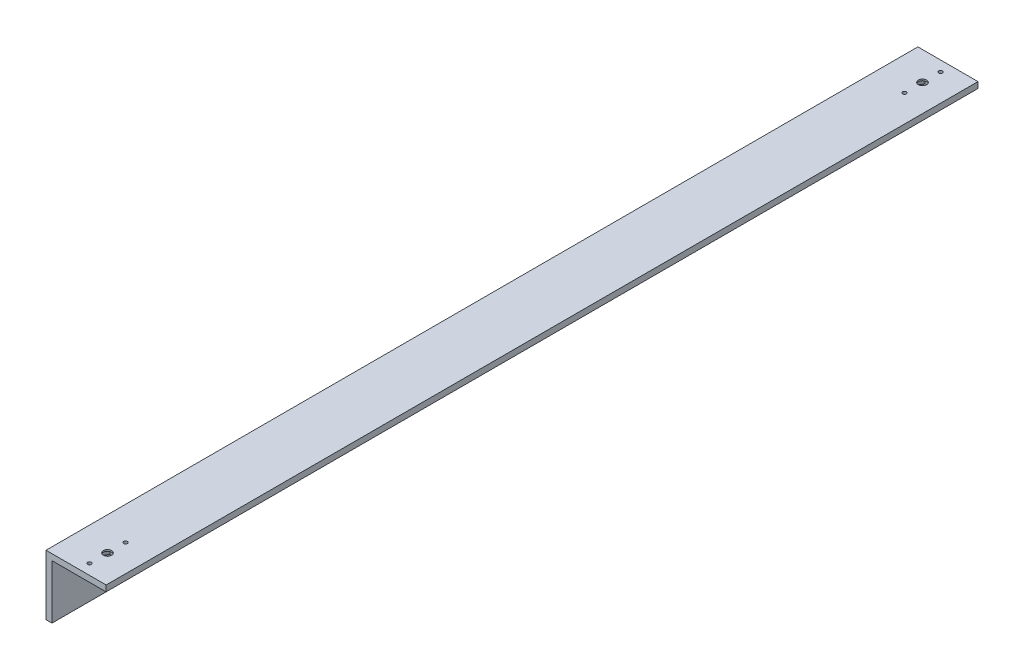
ISO-10303-21;
HEADER;
FILE_DESCRIPTION(('STEP AP214'),'2;1');
FILE_NAME('part.step','',(''),(''),'','','');
FILE_SCHEMA(('AUTOMOTIVE_DESIGN { 1 0 10303 214 1 1 1 1 }'));
ENDSEC;
DATA;
#1=APPLICATION_CONTEXT('core data for automotive mechanical design processes');
#2=APPLICATION_PROTOCOL_DEFINITION('international standard','automotive_design',2000,#1);
#3=PRODUCT_CONTEXT('',#1,'mechanical');
#4=PRODUCT('Part','Part','',(#3));
#5=PRODUCT_RELATED_PRODUCT_CATEGORY('part','',(#4));
#6=PRODUCT_DEFINITION_FORMATION('','',#4);
#7=PRODUCT_DEFINITION_CONTEXT('part definition',#1,'design');
#8=PRODUCT_DEFINITION('design','',#6,#7);
#9=PRODUCT_DEFINITION_SHAPE('','',#8);
#10=(LENGTH_UNIT() NAMED_UNIT(*) SI_UNIT(.MILLI.,.METRE.));
#11=(NAMED_UNIT(*) PLANE_ANGLE_UNIT() SI_UNIT($,.RADIAN.));
#12=(NAMED_UNIT(*) SI_UNIT($,.STERADIAN.) SOLID_ANGLE_UNIT());
#13=UNCERTAINTY_MEASURE_WITH_UNIT(LENGTH_MEASURE(1.E-05),#10,'distance_accuracy_value','');
#14=(GEOMETRIC_REPRESENTATION_CONTEXT(3) GLOBAL_UNCERTAINTY_ASSIGNED_CONTEXT((#13)) GLOBAL_UNIT_ASSIGNED_CONTEXT((#10,
#11,#12)) REPRESENTATION_CONTEXT('',''));
#15=CARTESIAN_POINT('',(0.,0.,0.));
#16=DIRECTION('',(0.,0.,1.));
#17=DIRECTION('',(1.,0.,0.));
#18=AXIS2_PLACEMENT_3D('',#15,#16,#17);
#19=CARTESIAN_POINT('',(40.,36.,580.));
#20=DIRECTION('',(0.,1.,0.));
#21=DIRECTION('',(-1.,0.,0.));
#22=AXIS2_PLACEMENT_3D('',#19,#20,#21);
#23=PLANE('',#22);
#24=CARTESIAN_POINT('',(21.9999999999999,36.,549.075735931289));
#25=DIRECTION('',(0.,1.,0.));
#26=DIRECTION('',(-1.,0.,0.));
#27=AXIS2_PLACEMENT_3D('',#24,#25,#26);
#28=CIRCLE('',#27,1.24999999999999);
#29=CARTESIAN_POINT('',(20.7499999999999,36.,549.075735931289));
#30=VERTEX_POINT('',#29);
#31=EDGE_CURVE('E348',#30,#30,#28,.T.);
#32=ORIENTED_EDGE('',*,*,#31,.T.);
#33=EDGE_LOOP('',(#32));
#34=FACE_BOUND('',#33,.T.);
#35=CARTESIAN_POINT('',(21.9999999999999,36.,573.075735931289));
#36=DIRECTION('',(0.,1.,0.));
#37=DIRECTION('',(-1.,0.,0.));
#38=AXIS2_PLACEMENT_3D('',#35,#36,#37);
#39=CIRCLE('',#38,1.24999999999999);
#40=CARTESIAN_POINT('',(20.7499999999999,36.,573.075735931289));
#41=VERTEX_POINT('',#40);
#42=EDGE_CURVE('E347',#41,#41,#39,.T.);
#43=ORIENTED_EDGE('',*,*,#42,.T.);
#44=EDGE_LOOP('',(#43));
#45=FACE_BOUND('',#44,.T.);
#46=CARTESIAN_POINT('',(21.9999999999999,36.,30.9242640687114));
#47=DIRECTION('',(0.,1.,0.));
#48=DIRECTION('',(-1.,0.,0.));
#49=AXIS2_PLACEMENT_3D('',#46,#47,#48);
#50=CIRCLE('',#49,1.24999999999999);
#51=CARTESIAN_POINT('',(20.7499999999999,36.,30.9242640687114));
#52=VERTEX_POINT('',#51);
#53=EDGE_CURVE('E374',#52,#52,#50,.T.);
#54=ORIENTED_EDGE('',*,*,#53,.T.);
#55=EDGE_LOOP('',(#54));
#56=FACE_BOUND('',#55,.T.);
#57=CARTESIAN_POINT('',(21.9999999999999,36.,6.9242640687114));
#58=DIRECTION('',(0.,1.,0.));
#59=DIRECTION('',(-1.,0.,0.));
#60=AXIS2_PLACEMENT_3D('',#57,#58,#59);
#61=CIRCLE('',#60,1.24999999999999);
#62=CARTESIAN_POINT('',(20.7499999999999,36.,6.9242640687114));
#63=VERTEX_POINT('',#62);
#64=EDGE_CURVE('E49',#63,#63,#61,.T.);
#65=ORIENTED_EDGE('',*,*,#64,.T.);
#66=EDGE_LOOP('',(#65));
#67=FACE_BOUND('',#66,.T.);
#68=DIRECTION('',(-0.5,0.,-0.866025403784439));
#69=VECTOR('',#68,1.);
#70=CARTESIAN_POINT('',(26.6188021535169,36.,561.075735931289));
#71=LINE('',#70,#69);
#72=CARTESIAN_POINT('',(26.6188021535169,36.,561.075735931289));
#73=VERTEX_POINT('',#72);
#74=CARTESIAN_POINT('',(24.3094010767584,36.,557.075735931289));
#75=VERTEX_POINT('',#74);
#76=EDGE_CURVE('E69',#73,#75,#71,.T.);
#77=ORIENTED_EDGE('',*,*,#76,.T.);
#78=DIRECTION('',(-1.,0.,0.));
#79=VECTOR('',#78,1.);
#80=CARTESIAN_POINT('',(24.3094010767584,36.,557.075735931289));
#81=LINE('',#80,#79);
#82=CARTESIAN_POINT('',(19.6905989232415,36.,557.075735931289));
#83=VERTEX_POINT('',#82);
#84=EDGE_CURVE('E426',#75,#83,#81,.T.);
#85=ORIENTED_EDGE('',*,*,#84,.T.);
#86=DIRECTION('',(-0.5,0.,0.866025403784439));
#87=VECTOR('',#86,1.);
#88=CARTESIAN_POINT('',(19.6905989232415,36.,557.075735931289));
#89=LINE('',#88,#87);
#90=CARTESIAN_POINT('',(17.3811978464829,36.,561.075735931289));
#91=VERTEX_POINT('',#90);
#92=EDGE_CURVE('E429',#83,#91,#89,.T.);
#93=ORIENTED_EDGE('',*,*,#92,.T.);
#94=DIRECTION('',(0.500000000000004,0.,0.866025403784436));
#95=VECTOR('',#94,1.);
#96=CARTESIAN_POINT('',(17.3811978464829,36.,561.075735931289));
#97=LINE('',#96,#95);
#98=CARTESIAN_POINT('',(19.6905989232415,36.,565.075735931289));
#99=VERTEX_POINT('',#98);
#100=EDGE_CURVE('E432',#91,#99,#97,.T.);
#101=ORIENTED_EDGE('',*,*,#100,.T.);
#102=DIRECTION('',(1.,0.,0.));
#103=VECTOR('',#102,1.);
#104=CARTESIAN_POINT('',(19.6905989232415,36.,565.075735931289));
#105=LINE('',#104,#103);
#106=CARTESIAN_POINT('',(24.3094010767584,36.,565.075735931289));
#107=VERTEX_POINT('',#106);
#108=EDGE_CURVE('E435',#99,#107,#105,.T.);
#109=ORIENTED_EDGE('',*,*,#108,.T.);
#110=DIRECTION('',(0.499999999999996,0.,-0.866025403784441));
#111=VECTOR('',#110,1.);
#112=CARTESIAN_POINT('',(24.3094010767584,36.,565.075735931289));
#113=LINE('',#112,#111);
#114=EDGE_CURVE('E438',#107,#73,#113,.T.);
#115=ORIENTED_EDGE('',*,*,#114,.T.);
#116=EDGE_LOOP('',(#77,#85,#93,#101,#109,#115));
#117=FACE_BOUND('',#116,.T.);
#118=DIRECTION('',(1.,0.,0.));
#119=VECTOR('',#118,1.);
#120=CARTESIAN_POINT('',(40.,36.,0.));
#121=LINE('',#120,#119);
#122=CARTESIAN_POINT('',(4.,36.,0.));
#123=VERTEX_POINT('',#122);
#124=CARTESIAN_POINT('',(40.,36.,0.));
#125=VERTEX_POINT('',#124);
#126=EDGE_CURVE('E311',#123,#125,#121,.T.);
#127=ORIENTED_EDGE('',*,*,#126,.T.);
#128=DIRECTION('',(0.,0.,-1.));
#129=VECTOR('',#128,1.);
#130=CARTESIAN_POINT('',(40.,36.,580.));
#131=LINE('',#130,#129);
#132=CARTESIAN_POINT('',(40.,36.,580.));
#133=VERTEX_POINT('',#132);
#134=EDGE_CURVE('E317',#133,#125,#131,.T.);
#135=ORIENTED_EDGE('',*,*,#134,.F.);
#136=DIRECTION('',(1.,0.,0.));
#137=VECTOR('',#136,1.);
#138=CARTESIAN_POINT('',(40.,36.,580.));
#139=LINE('',#138,#137);
#140=CARTESIAN_POINT('',(4.,36.,580.));
#141=VERTEX_POINT('',#140);
#142=EDGE_CURVE('E316',#141,#133,#139,.T.);
#143=ORIENTED_EDGE('',*,*,#142,.F.);
#144=DIRECTION('',(0.,0.,-1.));
#145=VECTOR('',#144,1.);
#146=CARTESIAN_POINT('',(4.,36.,580.));
#147=LINE('',#146,#145);
#148=EDGE_CURVE('E54',#141,#123,#147,.T.);
#149=ORIENTED_EDGE('',*,*,#148,.T.);
#150=EDGE_LOOP('',(#127,#135,#143,#149));
#151=FACE_BOUND('',#150,.T.);
#152=DIRECTION('',(-0.500000000000001,0.,-0.866025403784438));
#153=VECTOR('',#152,1.);
#154=CARTESIAN_POINT('',(26.6188021535169,36.,18.9242640687114));
#155=LINE('',#154,#153);
#156=CARTESIAN_POINT('',(26.6188021535169,36.,18.9242640687114));
#157=VERTEX_POINT('',#156);
#158=CARTESIAN_POINT('',(24.3094010767584,36.,14.9242640687114));
#159=VERTEX_POINT('',#158);
#160=EDGE_CURVE('E61',#157,#159,#155,.T.);
#161=ORIENTED_EDGE('',*,*,#160,.T.);
#162=DIRECTION('',(-1.,0.,0.));
#163=VECTOR('',#162,1.);
#164=CARTESIAN_POINT('',(24.3094010767584,36.,14.9242640687114));
#165=LINE('',#164,#163);
#166=CARTESIAN_POINT('',(19.6905989232414,36.,14.9242640687114));
#167=VERTEX_POINT('',#166);
#168=EDGE_CURVE('E194',#159,#167,#165,.T.);
#169=ORIENTED_EDGE('',*,*,#168,.T.);
#170=DIRECTION('',(-0.5,0.,0.866025403784439));
#171=VECTOR('',#170,1.);
#172=CARTESIAN_POINT('',(19.6905989232414,36.,14.9242640687114));
#173=LINE('',#172,#171);
#174=CARTESIAN_POINT('',(17.3811978464829,36.,18.9242640687114));
#175=VERTEX_POINT('',#174);
#176=EDGE_CURVE('E228',#167,#175,#173,.T.);
#177=ORIENTED_EDGE('',*,*,#176,.T.);
#178=DIRECTION('',(0.5,0.,0.866025403784438));
#179=VECTOR('',#178,1.);
#180=CARTESIAN_POINT('',(17.3811978464829,36.,18.9242640687114));
#181=LINE('',#180,#179);
#182=CARTESIAN_POINT('',(19.6905989232414,36.,22.9242640687114));
#183=VERTEX_POINT('',#182);
#184=EDGE_CURVE('E231',#175,#183,#181,.T.);
#185=ORIENTED_EDGE('',*,*,#184,.T.);
#186=DIRECTION('',(1.,0.,0.));
#187=VECTOR('',#186,1.);
#188=CARTESIAN_POINT('',(19.6905989232414,36.,22.9242640687114));
#189=LINE('',#188,#187);
#190=CARTESIAN_POINT('',(24.3094010767584,36.,22.9242640687114));
#191=VERTEX_POINT('',#190);
#192=EDGE_CURVE('E234',#183,#191,#189,.T.);
#193=ORIENTED_EDGE('',*,*,#192,.T.);
#194=DIRECTION('',(0.5,0.,-0.866025403784438));
#195=VECTOR('',#194,1.);
#196=CARTESIAN_POINT('',(24.3094010767584,36.,22.9242640687114));
#197=LINE('',#196,#195);
#198=EDGE_CURVE('E190',#191,#157,#197,.T.);
#199=ORIENTED_EDGE('',*,*,#198,.T.);
#200=EDGE_LOOP('',(#161,#169,#177,#185,#193,#199));
#201=FACE_BOUND('',#200,.T.);
#202=ADVANCED_FACE('F45',(#34,#45,#56,#67,#117,#151,#201),#23,.F.);
#203=CARTESIAN_POINT('',(4.,0.,580.));
#204=DIRECTION('',(0.,1.,0.));
#205=DIRECTION('',(-1.,0.,0.));
#206=AXIS2_PLACEMENT_3D('',#203,#204,#205);
#207=PLANE('',#206);
#208=DIRECTION('',(1.,0.,0.));
#209=VECTOR('',#208,1.);
#210=CARTESIAN_POINT('',(4.,0.,0.));
#211=LINE('',#210,#209);
#212=CARTESIAN_POINT('',(0.,0.,0.));
#213=VERTEX_POINT('',#212);
#214=CARTESIAN_POINT('',(4.,0.,0.));
#215=VERTEX_POINT('',#214);
#216=EDGE_CURVE('E195',#213,#215,#211,.T.);
#217=ORIENTED_EDGE('',*,*,#216,.T.);
#218=DIRECTION('',(0.,0.,-1.));
#219=VECTOR('',#218,1.);
#220=CARTESIAN_POINT('',(4.,0.,580.));
#221=LINE('',#220,#219);
#222=CARTESIAN_POINT('',(4.,0.,580.));
#223=VERTEX_POINT('',#222);
#224=EDGE_CURVE('E12',#223,#215,#221,.T.);
#225=ORIENTED_EDGE('',*,*,#224,.F.);
#226=DIRECTION('',(1.,0.,0.));
#227=VECTOR('',#226,1.);
#228=CARTESIAN_POINT('',(4.,0.,580.));
#229=LINE('',#228,#227);
#230=CARTESIAN_POINT('',(0.,0.,580.));
#231=VERTEX_POINT('',#230);
#232=EDGE_CURVE('E528',#231,#223,#229,.T.);
#233=ORIENTED_EDGE('',*,*,#232,.F.);
#234=DIRECTION('',(0.,0.,-1.));
#235=VECTOR('',#234,1.);
#236=CARTESIAN_POINT('',(0.,0.,580.));
#237=LINE('',#236,#235);
#238=EDGE_CURVE('E526',#231,#213,#237,.T.);
#239=ORIENTED_EDGE('',*,*,#238,.T.);
#240=EDGE_LOOP('',(#217,#225,#233,#239));
#241=FACE_BOUND('',#240,.T.);
#242=ADVANCED_FACE('F47',(#241),#207,.F.);
#243=CARTESIAN_POINT('',(4.,36.,580.));
#244=DIRECTION('',(-1.,0.,0.));
#245=DIRECTION('',(0.,-1.,0.));
#246=AXIS2_PLACEMENT_3D('',#243,#244,#245);
#247=PLANE('',#246);
#248=DIRECTION('',(0.,1.,0.));
#249=VECTOR('',#248,1.);
#250=CARTESIAN_POINT('',(4.,36.,0.));
#251=LINE('',#250,#249);
#252=EDGE_CURVE('E199',#215,#123,#251,.T.);
#253=ORIENTED_EDGE('',*,*,#252,.T.);
#254=ORIENTED_EDGE('',*,*,#148,.F.);
#255=DIRECTION('',(0.,1.,0.));
#256=VECTOR('',#255,1.);
#257=CARTESIAN_POINT('',(4.,36.,580.));
#258=LINE('',#257,#256);
#259=EDGE_CURVE('E530',#223,#141,#258,.T.);
#260=ORIENTED_EDGE('',*,*,#259,.F.);
#261=ORIENTED_EDGE('',*,*,#224,.T.);
#262=EDGE_LOOP('',(#253,#254,#260,#261));
#263=FACE_BOUND('',#262,.T.);
#264=ADVANCED_FACE('F290',(#263),#247,.F.);
#265=CARTESIAN_POINT('',(40.,40.,580.));
#266=DIRECTION('',(-1.,0.,0.));
#267=DIRECTION('',(0.,0.,1.));
#268=AXIS2_PLACEMENT_3D('',#265,#266,#267);
#269=PLANE('',#268);
#270=DIRECTION('',(0.,1.,0.));
#271=VECTOR('',#270,1.);
#272=CARTESIAN_POINT('',(40.,40.,0.));
#273=LINE('',#272,#271);
#274=CARTESIAN_POINT('',(40.,40.,0.));
#275=VERTEX_POINT('',#274);
#276=EDGE_CURVE('E322',#125,#275,#273,.T.);
#277=ORIENTED_EDGE('',*,*,#276,.T.);
#278=DIRECTION('',(0.,0.,-1.));
#279=VECTOR('',#278,1.);
#280=CARTESIAN_POINT('',(40.,40.,580.));
#281=LINE('',#280,#279);
#282=CARTESIAN_POINT('',(40.,40.,580.));
#283=VERTEX_POINT('',#282);
#284=EDGE_CURVE('E519',#283,#275,#281,.T.);
#285=ORIENTED_EDGE('',*,*,#284,.F.);
#286=DIRECTION('',(0.,1.,0.));
#287=VECTOR('',#286,1.);
#288=CARTESIAN_POINT('',(40.,40.,580.));
#289=LINE('',#288,#287);
#290=EDGE_CURVE('E535',#133,#283,#289,.T.);
#291=ORIENTED_EDGE('',*,*,#290,.F.);
#292=ORIENTED_EDGE('',*,*,#134,.T.);
#293=EDGE_LOOP('',(#277,#285,#291,#292));
#294=FACE_BOUND('',#293,.T.);
#295=ADVANCED_FACE('F295',(#294),#269,.F.);
#296=CARTESIAN_POINT('',(0.,40.,580.));
#297=DIRECTION('',(0.,-1.,0.));
#298=DIRECTION('',(0.,0.,-1.));
#299=AXIS2_PLACEMENT_3D('',#296,#297,#298);
#300=PLANE('',#299);
#301=CARTESIAN_POINT('',(22.,40.,561.075735931289));
#302=DIRECTION('',(0.,-1.,0.));
#303=DIRECTION('',(0.,0.,-1.));
#304=AXIS2_PLACEMENT_3D('',#301,#302,#303);
#305=CIRCLE('',#304,2.75);
#306=CARTESIAN_POINT('',(22.,40.,558.325735931289));
#307=VERTEX_POINT('',#306);
#308=EDGE_CURVE('E500',#307,#307,#305,.T.);
#309=ORIENTED_EDGE('',*,*,#308,.T.);
#310=EDGE_LOOP('',(#309));
#311=FACE_BOUND('',#310,.T.);
#312=CARTESIAN_POINT('',(21.9999999999999,40.,18.9242640687114));
#313=DIRECTION('',(0.,-1.,0.));
#314=DIRECTION('',(0.,0.,-1.));
#315=AXIS2_PLACEMENT_3D('',#312,#313,#314);
#316=CIRCLE('',#315,2.75);
#317=CARTESIAN_POINT('',(21.9999999999999,40.,16.1742640687114));
#318=VERTEX_POINT('',#317);
#319=EDGE_CURVE('E359',#318,#318,#316,.T.);
#320=ORIENTED_EDGE('',*,*,#319,.T.);
#321=EDGE_LOOP('',(#320));
#322=FACE_BOUND('',#321,.T.);
#323=CARTESIAN_POINT('',(21.9999999999999,40.,549.075735931289));
#324=DIRECTION('',(0.,1.,0.));
#325=DIRECTION('',(0.,0.,1.));
#326=AXIS2_PLACEMENT_3D('',#323,#324,#325);
#327=CIRCLE('',#326,1.24999999999999);
#328=CARTESIAN_POINT('',(21.9999999999999,40.,550.325735931288));
#329=VERTEX_POINT('',#328);
#330=EDGE_CURVE('E364',#329,#329,#327,.T.);
#331=ORIENTED_EDGE('',*,*,#330,.F.);
#332=EDGE_LOOP('',(#331));
#333=FACE_BOUND('',#332,.T.);
#334=CARTESIAN_POINT('',(21.9999999999999,40.,573.075735931289));
#335=DIRECTION('',(0.,1.,0.));
#336=DIRECTION('',(0.,0.,1.));
#337=AXIS2_PLACEMENT_3D('',#334,#335,#336);
#338=CIRCLE('',#337,1.24999999999999);
#339=CARTESIAN_POINT('',(21.9999999999999,40.,574.325735931289));
#340=VERTEX_POINT('',#339);
#341=EDGE_CURVE('E341',#340,#340,#338,.T.);
#342=ORIENTED_EDGE('',*,*,#341,.F.);
#343=EDGE_LOOP('',(#342));
#344=FACE_BOUND('',#343,.T.);
#345=CARTESIAN_POINT('',(21.9999999999999,40.,30.9242640687114));
#346=DIRECTION('',(0.,1.,0.));
#347=DIRECTION('',(0.,0.,1.));
#348=AXIS2_PLACEMENT_3D('',#345,#346,#347);
#349=CIRCLE('',#348,1.24999999999999);
#350=CARTESIAN_POINT('',(21.9999999999999,40.,32.1742640687114));
#351=VERTEX_POINT('',#350);
#352=EDGE_CURVE('E370',#351,#351,#349,.T.);
#353=ORIENTED_EDGE('',*,*,#352,.F.);
#354=EDGE_LOOP('',(#353));
#355=FACE_BOUND('',#354,.T.);
#356=CARTESIAN_POINT('',(21.9999999999999,40.,6.9242640687114));
#357=DIRECTION('',(0.,1.,0.));
#358=DIRECTION('',(0.,0.,1.));
#359=AXIS2_PLACEMENT_3D('',#356,#357,#358);
#360=CIRCLE('',#359,1.24999999999999);
#361=CARTESIAN_POINT('',(21.9999999999999,40.,8.1742640687114));
#362=VERTEX_POINT('',#361);
#363=EDGE_CURVE('E378',#362,#362,#360,.T.);
#364=ORIENTED_EDGE('',*,*,#363,.F.);
#365=EDGE_LOOP('',(#364));
#366=FACE_BOUND('',#365,.T.);
#367=DIRECTION('',(-1.,0.,0.));
#368=VECTOR('',#367,1.);
#369=CARTESIAN_POINT('',(0.,40.,0.));
#370=LINE('',#369,#368);
#371=CARTESIAN_POINT('',(0.,40.,0.));
#372=VERTEX_POINT('',#371);
#373=EDGE_CURVE('E325',#275,#372,#370,.T.);
#374=ORIENTED_EDGE('',*,*,#373,.T.);
#375=DIRECTION('',(0.,0.,-1.));
#376=VECTOR('',#375,1.);
#377=CARTESIAN_POINT('',(0.,40.,580.));
#378=LINE('',#377,#376);
#379=CARTESIAN_POINT('',(0.,40.,580.));
#380=VERTEX_POINT('',#379);
#381=EDGE_CURVE('E516',#380,#372,#378,.T.);
#382=ORIENTED_EDGE('',*,*,#381,.F.);
#383=DIRECTION('',(-1.,0.,0.));
#384=VECTOR('',#383,1.);
#385=CARTESIAN_POINT('',(0.,40.,580.));
#386=LINE('',#385,#384);
#387=EDGE_CURVE('E536',#283,#380,#386,.T.);
#388=ORIENTED_EDGE('',*,*,#387,.F.);
#389=ORIENTED_EDGE('',*,*,#284,.T.);
#390=EDGE_LOOP('',(#374,#382,#388,#389));
#391=FACE_BOUND('',#390,.T.);
#392=ADVANCED_FACE('F302',(#311,#322,#333,#344,#355,#366,#391),#300,.F.);
#393=CARTESIAN_POINT('',(0.,0.,580.));
#394=DIRECTION('',(1.,0.,0.));
#395=DIRECTION('',(0.,0.,-1.));
#396=AXIS2_PLACEMENT_3D('',#393,#394,#395);
#397=PLANE('',#396);
#398=DIRECTION('',(0.,-1.,0.));
#399=VECTOR('',#398,1.);
#400=CARTESIAN_POINT('',(0.,0.,0.));
#401=LINE('',#400,#399);
#402=EDGE_CURVE('E522',#372,#213,#401,.T.);
#403=ORIENTED_EDGE('',*,*,#402,.T.);
#404=ORIENTED_EDGE('',*,*,#238,.F.);
#405=DIRECTION('',(0.,-1.,0.));
#406=VECTOR('',#405,1.);
#407=CARTESIAN_POINT('',(0.,0.,580.));
#408=LINE('',#407,#406);
#409=EDGE_CURVE('E525',#380,#231,#408,.T.);
#410=ORIENTED_EDGE('',*,*,#409,.F.);
#411=ORIENTED_EDGE('',*,*,#381,.T.);
#412=EDGE_LOOP('',(#403,#404,#410,#411));
#413=FACE_BOUND('',#412,.T.);
#414=ADVANCED_FACE('F487',(#413),#397,.F.);
#415=CARTESIAN_POINT('',(0.,0.,580.));
#416=DIRECTION('',(0.,0.,-1.));
#417=DIRECTION('',(-1.,0.,0.));
#418=AXIS2_PLACEMENT_3D('',#415,#416,#417);
#419=PLANE('',#418);
#420=ORIENTED_EDGE('',*,*,#232,.T.);
#421=ORIENTED_EDGE('',*,*,#259,.T.);
#422=ORIENTED_EDGE('',*,*,#142,.T.);
#423=ORIENTED_EDGE('',*,*,#290,.T.);
#424=ORIENTED_EDGE('',*,*,#387,.T.);
#425=ORIENTED_EDGE('',*,*,#409,.T.);
#426=EDGE_LOOP('',(#420,#421,#422,#423,#424,#425));
#427=FACE_BOUND('',#426,.T.);
#428=ADVANCED_FACE('F484',(#427),#419,.F.);
#429=CARTESIAN_POINT('',(0.,0.,0.));
#430=DIRECTION('',(0.,0.,-1.));
#431=DIRECTION('',(-1.,0.,0.));
#432=AXIS2_PLACEMENT_3D('',#429,#430,#431);
#433=PLANE('',#432);
#434=ORIENTED_EDGE('',*,*,#216,.F.);
#435=ORIENTED_EDGE('',*,*,#402,.F.);
#436=ORIENTED_EDGE('',*,*,#373,.F.);
#437=ORIENTED_EDGE('',*,*,#276,.F.);
#438=ORIENTED_EDGE('',*,*,#126,.F.);
#439=ORIENTED_EDGE('',*,*,#252,.F.);
#440=EDGE_LOOP('',(#434,#435,#436,#437,#438,#439));
#441=FACE_BOUND('',#440,.T.);
#442=ADVANCED_FACE('F320',(#441),#433,.T.);
#443=CARTESIAN_POINT('',(26.6188021535169,39.,561.075735931289));
#444=DIRECTION('',(-0.866025403784439,0.,0.5));
#445=DIRECTION('',(0.5,0.,0.866025403784439));
#446=AXIS2_PLACEMENT_3D('',#443,#444,#445);
#447=PLANE('',#446);
#448=ORIENTED_EDGE('',*,*,#76,.F.);
#449=DIRECTION('',(0.,-1.,0.));
#450=VECTOR('',#449,1.);
#451=CARTESIAN_POINT('',(26.6188021535169,39.,561.075735931289));
#452=LINE('',#451,#450);
#453=CARTESIAN_POINT('',(26.6188021535169,39.,561.075735931289));
#454=VERTEX_POINT('',#453);
#455=EDGE_CURVE('E424',#454,#73,#452,.T.);
#456=ORIENTED_EDGE('',*,*,#455,.F.);
#457=DIRECTION('',(-0.5,0.,-0.866025403784439));
#458=VECTOR('',#457,1.);
#459=CARTESIAN_POINT('',(26.6188021535169,39.,561.075735931289));
#460=LINE('',#459,#458);
#461=CARTESIAN_POINT('',(24.3094010767584,39.,557.075735931289));
#462=VERTEX_POINT('',#461);
#463=EDGE_CURVE('E207',#454,#462,#460,.T.);
#464=ORIENTED_EDGE('',*,*,#463,.T.);
#465=DIRECTION('',(0.,-1.,0.));
#466=VECTOR('',#465,1.);
#467=CARTESIAN_POINT('',(24.3094010767584,39.,557.075735931289));
#468=LINE('',#467,#466);
#469=EDGE_CURVE('E226',#462,#75,#468,.T.);
#470=ORIENTED_EDGE('',*,*,#469,.T.);
#471=EDGE_LOOP('',(#448,#456,#464,#470));
#472=FACE_BOUND('',#471,.T.);
#473=ADVANCED_FACE('F468',(#472),#447,.T.);
#474=CARTESIAN_POINT('',(24.3094010767584,39.,557.075735931289));
#475=DIRECTION('',(0.,0.,1.));
#476=DIRECTION('',(1.,0.,0.));
#477=AXIS2_PLACEMENT_3D('',#474,#475,#476);
#478=PLANE('',#477);
#479=ORIENTED_EDGE('',*,*,#84,.F.);
#480=ORIENTED_EDGE('',*,*,#469,.F.);
#481=DIRECTION('',(-1.,0.,0.));
#482=VECTOR('',#481,1.);
#483=CARTESIAN_POINT('',(24.3094010767584,39.,557.075735931289));
#484=LINE('',#483,#482);
#485=CARTESIAN_POINT('',(19.6905989232415,39.,557.075735931289));
#486=VERTEX_POINT('',#485);
#487=EDGE_CURVE('E470',#462,#486,#484,.T.);
#488=ORIENTED_EDGE('',*,*,#487,.T.);
#489=DIRECTION('',(0.,-1.,0.));
#490=VECTOR('',#489,1.);
#491=CARTESIAN_POINT('',(19.6905989232415,39.,557.075735931289));
#492=LINE('',#491,#490);
#493=EDGE_CURVE('E408',#486,#83,#492,.T.);
#494=ORIENTED_EDGE('',*,*,#493,.T.);
#495=EDGE_LOOP('',(#479,#480,#488,#494));
#496=FACE_BOUND('',#495,.T.);
#497=ADVANCED_FACE('F473',(#496),#478,.T.);
#498=CARTESIAN_POINT('',(19.6905989232415,39.,557.075735931289));
#499=DIRECTION('',(0.866025403784439,0.,0.5));
#500=DIRECTION('',(0.5,0.,-0.866025403784439));
#501=AXIS2_PLACEMENT_3D('',#498,#499,#500);
#502=PLANE('',#501);
#503=ORIENTED_EDGE('',*,*,#92,.F.);
#504=ORIENTED_EDGE('',*,*,#493,.F.);
#505=DIRECTION('',(-0.5,0.,0.866025403784439));
#506=VECTOR('',#505,1.);
#507=CARTESIAN_POINT('',(19.6905989232415,39.,557.075735931289));
#508=LINE('',#507,#506);
#509=CARTESIAN_POINT('',(17.3811978464829,39.,561.075735931289));
#510=VERTEX_POINT('',#509);
#511=EDGE_CURVE('E393',#486,#510,#508,.T.);
#512=ORIENTED_EDGE('',*,*,#511,.T.);
#513=DIRECTION('',(0.,-1.,0.));
#514=VECTOR('',#513,1.);
#515=CARTESIAN_POINT('',(17.3811978464829,39.,561.075735931289));
#516=LINE('',#515,#514);
#517=EDGE_CURVE('E404',#510,#91,#516,.T.);
#518=ORIENTED_EDGE('',*,*,#517,.T.);
#519=EDGE_LOOP('',(#503,#504,#512,#518));
#520=FACE_BOUND('',#519,.T.);
#521=ADVANCED_FACE('F459',(#520),#502,.T.);
#522=CARTESIAN_POINT('',(17.3811978464829,39.,561.075735931289));
#523=DIRECTION('',(0.866025403784436,0.,-0.500000000000004));
#524=DIRECTION('',(-0.500000000000004,0.,-0.866025403784436));
#525=AXIS2_PLACEMENT_3D('',#522,#523,#524);
#526=PLANE('',#525);
#527=ORIENTED_EDGE('',*,*,#100,.F.);
#528=ORIENTED_EDGE('',*,*,#517,.F.);
#529=DIRECTION('',(0.500000000000004,0.,0.866025403784436));
#530=VECTOR('',#529,1.);
#531=CARTESIAN_POINT('',(17.3811978464829,39.,561.075735931289));
#532=LINE('',#531,#530);
#533=CARTESIAN_POINT('',(19.6905989232415,39.,565.075735931289));
#534=VERTEX_POINT('',#533);
#535=EDGE_CURVE('E387',#510,#534,#532,.T.);
#536=ORIENTED_EDGE('',*,*,#535,.T.);
#537=DIRECTION('',(0.,-1.,0.));
#538=VECTOR('',#537,1.);
#539=CARTESIAN_POINT('',(19.6905989232415,39.,565.075735931289));
#540=LINE('',#539,#538);
#541=EDGE_CURVE('E409',#534,#99,#540,.T.);
#542=ORIENTED_EDGE('',*,*,#541,.T.);
#543=EDGE_LOOP('',(#527,#528,#536,#542));
#544=FACE_BOUND('',#543,.T.);
#545=ADVANCED_FACE('F450',(#544),#526,.T.);
#546=CARTESIAN_POINT('',(19.6905989232415,39.,565.075735931289));
#547=DIRECTION('',(0.,0.,-1.));
#548=DIRECTION('',(-1.,0.,0.));
#549=AXIS2_PLACEMENT_3D('',#546,#547,#548);
#550=PLANE('',#549);
#551=ORIENTED_EDGE('',*,*,#108,.F.);
#552=ORIENTED_EDGE('',*,*,#541,.F.);
#553=DIRECTION('',(1.,0.,0.));
#554=VECTOR('',#553,1.);
#555=CARTESIAN_POINT('',(19.6905989232415,39.,565.075735931289));
#556=LINE('',#555,#554);
#557=CARTESIAN_POINT('',(24.3094010767584,39.,565.075735931289));
#558=VERTEX_POINT('',#557);
#559=EDGE_CURVE('E392',#534,#558,#556,.T.);
#560=ORIENTED_EDGE('',*,*,#559,.T.);
#561=DIRECTION('',(0.,-1.,0.));
#562=VECTOR('',#561,1.);
#563=CARTESIAN_POINT('',(24.3094010767584,39.,565.075735931289));
#564=LINE('',#563,#562);
#565=EDGE_CURVE('E441',#558,#107,#564,.T.);
#566=ORIENTED_EDGE('',*,*,#565,.T.);
#567=EDGE_LOOP('',(#551,#552,#560,#566));
#568=FACE_BOUND('',#567,.T.);
#569=ADVANCED_FACE('F454',(#568),#550,.T.);
#570=CARTESIAN_POINT('',(24.3094010767584,39.,565.075735931289));
#571=DIRECTION('',(-0.866025403784441,0.,-0.499999999999996));
#572=DIRECTION('',(-0.499999999999996,0.,0.866025403784441));
#573=AXIS2_PLACEMENT_3D('',#570,#571,#572);
#574=PLANE('',#573);
#575=ORIENTED_EDGE('',*,*,#114,.F.);
#576=ORIENTED_EDGE('',*,*,#565,.F.);
#577=DIRECTION('',(0.499999999999996,0.,-0.866025403784441));
#578=VECTOR('',#577,1.);
#579=CARTESIAN_POINT('',(24.3094010767584,39.,565.075735931289));
#580=LINE('',#579,#578);
#581=EDGE_CURVE('E421',#558,#454,#580,.T.);
#582=ORIENTED_EDGE('',*,*,#581,.T.);
#583=ORIENTED_EDGE('',*,*,#455,.T.);
#584=EDGE_LOOP('',(#575,#576,#582,#583));
#585=FACE_BOUND('',#584,.T.);
#586=ADVANCED_FACE('F466',(#585),#574,.T.);
#587=CARTESIAN_POINT('',(0.,39.,0.));
#588=DIRECTION('',(0.,1.,0.));
#589=DIRECTION('',(0.,0.,1.));
#590=AXIS2_PLACEMENT_3D('',#587,#588,#589);
#591=PLANE('',#590);
#592=CARTESIAN_POINT('',(22.,39.,561.075735931289));
#593=DIRECTION('',(0.,-1.,0.));
#594=DIRECTION('',(0.,0.,-1.));
#595=AXIS2_PLACEMENT_3D('',#592,#593,#594);
#596=CIRCLE('',#595,2.74999999999999);
#597=CARTESIAN_POINT('',(22.,39.,558.325735931289));
#598=VERTEX_POINT('',#597);
#599=EDGE_CURVE('E755',#598,#598,#596,.T.);
#600=ORIENTED_EDGE('',*,*,#599,.F.);
#601=EDGE_LOOP('',(#600));
#602=FACE_BOUND('',#601,.T.);
#603=ORIENTED_EDGE('',*,*,#463,.F.);
#604=ORIENTED_EDGE('',*,*,#581,.F.);
#605=ORIENTED_EDGE('',*,*,#559,.F.);
#606=ORIENTED_EDGE('',*,*,#535,.F.);
#607=ORIENTED_EDGE('',*,*,#511,.F.);
#608=ORIENTED_EDGE('',*,*,#487,.F.);
#609=EDGE_LOOP('',(#603,#604,#605,#606,#607,#608));
#610=FACE_BOUND('',#609,.T.);
#611=ADVANCED_FACE('F463',(#602,#610),#591,.F.);
#612=CARTESIAN_POINT('',(26.6188021535169,39.,18.9242640687114));
#613=DIRECTION('',(-0.866025403784438,0.,0.500000000000001));
#614=DIRECTION('',(0.500000000000001,0.,0.866025403784438));
#615=AXIS2_PLACEMENT_3D('',#612,#613,#614);
#616=PLANE('',#615);
#617=ORIENTED_EDGE('',*,*,#160,.F.);
#618=DIRECTION('',(0.,-1.,0.));
#619=VECTOR('',#618,1.);
#620=CARTESIAN_POINT('',(26.6188021535169,39.,18.9242640687114));
#621=LINE('',#620,#619);
#622=CARTESIAN_POINT('',(26.6188021535169,39.,18.9242640687114));
#623=VERTEX_POINT('',#622);
#624=EDGE_CURVE('E189',#623,#157,#621,.T.);
#625=ORIENTED_EDGE('',*,*,#624,.F.);
#626=DIRECTION('',(-0.500000000000001,0.,-0.866025403784438));
#627=VECTOR('',#626,1.);
#628=CARTESIAN_POINT('',(26.6188021535169,39.,18.9242640687114));
#629=LINE('',#628,#627);
#630=CARTESIAN_POINT('',(24.3094010767584,39.,14.9242640687114));
#631=VERTEX_POINT('',#630);
#632=EDGE_CURVE('E180',#623,#631,#629,.T.);
#633=ORIENTED_EDGE('',*,*,#632,.T.);
#634=DIRECTION('',(0.,-1.,0.));
#635=VECTOR('',#634,1.);
#636=CARTESIAN_POINT('',(24.3094010767584,39.,14.9242640687114));
#637=LINE('',#636,#635);
#638=EDGE_CURVE('E188',#631,#159,#637,.T.);
#639=ORIENTED_EDGE('',*,*,#638,.T.);
#640=EDGE_LOOP('',(#617,#625,#633,#639));
#641=FACE_BOUND('',#640,.T.);
#642=ADVANCED_FACE('F187',(#641),#616,.T.);
#643=CARTESIAN_POINT('',(24.3094010767584,39.,14.9242640687114));
#644=DIRECTION('',(0.,0.,1.));
#645=DIRECTION('',(1.,0.,0.));
#646=AXIS2_PLACEMENT_3D('',#643,#644,#645);
#647=PLANE('',#646);
#648=ORIENTED_EDGE('',*,*,#168,.F.);
#649=ORIENTED_EDGE('',*,*,#638,.F.);
#650=DIRECTION('',(-1.,0.,0.));
#651=VECTOR('',#650,1.);
#652=CARTESIAN_POINT('',(24.3094010767584,39.,14.9242640687114));
#653=LINE('',#652,#651);
#654=CARTESIAN_POINT('',(19.6905989232414,39.,14.9242640687114));
#655=VERTEX_POINT('',#654);
#656=EDGE_CURVE('E176',#631,#655,#653,.T.);
#657=ORIENTED_EDGE('',*,*,#656,.T.);
#658=DIRECTION('',(0.,-1.,0.));
#659=VECTOR('',#658,1.);
#660=CARTESIAN_POINT('',(19.6905989232414,39.,14.9242640687114));
#661=LINE('',#660,#659);
#662=EDGE_CURVE('E196',#655,#167,#661,.T.);
#663=ORIENTED_EDGE('',*,*,#662,.T.);
#664=EDGE_LOOP('',(#648,#649,#657,#663));
#665=FACE_BOUND('',#664,.T.);
#666=ADVANCED_FACE('F192',(#665),#647,.T.);
#667=CARTESIAN_POINT('',(19.6905989232414,39.,14.9242640687114));
#668=DIRECTION('',(0.866025403784439,0.,0.5));
#669=DIRECTION('',(0.5,0.,-0.866025403784439));
#670=AXIS2_PLACEMENT_3D('',#667,#668,#669);
#671=PLANE('',#670);
#672=ORIENTED_EDGE('',*,*,#176,.F.);
#673=ORIENTED_EDGE('',*,*,#662,.F.);
#674=DIRECTION('',(-0.5,0.,0.866025403784439));
#675=VECTOR('',#674,1.);
#676=CARTESIAN_POINT('',(19.6905989232414,39.,14.9242640687114));
#677=LINE('',#676,#675);
#678=CARTESIAN_POINT('',(17.3811978464829,39.,18.9242640687114));
#679=VERTEX_POINT('',#678);
#680=EDGE_CURVE('E182',#655,#679,#677,.T.);
#681=ORIENTED_EDGE('',*,*,#680,.T.);
#682=DIRECTION('',(0.,-1.,0.));
#683=VECTOR('',#682,1.);
#684=CARTESIAN_POINT('',(17.3811978464829,39.,18.9242640687114));
#685=LINE('',#684,#683);
#686=EDGE_CURVE('E201',#679,#175,#685,.T.);
#687=ORIENTED_EDGE('',*,*,#686,.T.);
#688=EDGE_LOOP('',(#672,#673,#681,#687));
#689=FACE_BOUND('',#688,.T.);
#690=ADVANCED_FACE('F275',(#689),#671,.T.);
#691=CARTESIAN_POINT('',(17.3811978464829,39.,18.9242640687114));
#692=DIRECTION('',(0.866025403784438,0.,-0.5));
#693=DIRECTION('',(-0.5,0.,-0.866025403784438));
#694=AXIS2_PLACEMENT_3D('',#691,#692,#693);
#695=PLANE('',#694);
#696=ORIENTED_EDGE('',*,*,#184,.F.);
#697=ORIENTED_EDGE('',*,*,#686,.F.);
#698=DIRECTION('',(0.5,0.,0.866025403784438));
#699=VECTOR('',#698,1.);
#700=CARTESIAN_POINT('',(17.3811978464829,39.,18.9242640687114));
#701=LINE('',#700,#699);
#702=CARTESIAN_POINT('',(19.6905989232414,39.,22.9242640687114));
#703=VERTEX_POINT('',#702);
#704=EDGE_CURVE('E253',#679,#703,#701,.T.);
#705=ORIENTED_EDGE('',*,*,#704,.T.);
#706=DIRECTION('',(0.,-1.,0.));
#707=VECTOR('',#706,1.);
#708=CARTESIAN_POINT('',(19.6905989232414,39.,22.9242640687114));
#709=LINE('',#708,#707);
#710=EDGE_CURVE('E242',#703,#183,#709,.T.);
#711=ORIENTED_EDGE('',*,*,#710,.T.);
#712=EDGE_LOOP('',(#696,#697,#705,#711));
#713=FACE_BOUND('',#712,.T.);
#714=ADVANCED_FACE('F273',(#713),#695,.T.);
#715=CARTESIAN_POINT('',(19.6905989232414,39.,22.9242640687114));
#716=DIRECTION('',(0.,0.,-1.));
#717=DIRECTION('',(-1.,0.,0.));
#718=AXIS2_PLACEMENT_3D('',#715,#716,#717);
#719=PLANE('',#718);
#720=ORIENTED_EDGE('',*,*,#192,.F.);
#721=ORIENTED_EDGE('',*,*,#710,.F.);
#722=DIRECTION('',(1.,0.,0.));
#723=VECTOR('',#722,1.);
#724=CARTESIAN_POINT('',(19.6905989232414,39.,22.9242640687114));
#725=LINE('',#724,#723);
#726=CARTESIAN_POINT('',(24.3094010767584,39.,22.9242640687114));
#727=VERTEX_POINT('',#726);
#728=EDGE_CURVE('E222',#703,#727,#725,.T.);
#729=ORIENTED_EDGE('',*,*,#728,.T.);
#730=DIRECTION('',(0.,-1.,0.));
#731=VECTOR('',#730,1.);
#732=CARTESIAN_POINT('',(24.3094010767584,39.,22.9242640687114));
#733=LINE('',#732,#731);
#734=EDGE_CURVE('E240',#727,#191,#733,.T.);
#735=ORIENTED_EDGE('',*,*,#734,.T.);
#736=EDGE_LOOP('',(#720,#721,#729,#735));
#737=FACE_BOUND('',#736,.T.);
#738=ADVANCED_FACE('F266',(#737),#719,.T.);
#739=CARTESIAN_POINT('',(24.3094010767584,39.,22.9242640687114));
#740=DIRECTION('',(-0.866025403784439,0.,-0.5));
#741=DIRECTION('',(-0.5,0.,0.866025403784439));
#742=AXIS2_PLACEMENT_3D('',#739,#740,#741);
#743=PLANE('',#742);
#744=ORIENTED_EDGE('',*,*,#198,.F.);
#745=ORIENTED_EDGE('',*,*,#734,.F.);
#746=DIRECTION('',(0.5,0.,-0.866025403784438));
#747=VECTOR('',#746,1.);
#748=CARTESIAN_POINT('',(24.3094010767584,39.,22.9242640687114));
#749=LINE('',#748,#747);
#750=EDGE_CURVE('E218',#727,#623,#749,.T.);
#751=ORIENTED_EDGE('',*,*,#750,.T.);
#752=ORIENTED_EDGE('',*,*,#624,.T.);
#753=EDGE_LOOP('',(#744,#745,#751,#752));
#754=FACE_BOUND('',#753,.T.);
#755=ADVANCED_FACE('F269',(#754),#743,.T.);
#756=CARTESIAN_POINT('',(0.,39.,0.));
#757=DIRECTION('',(0.,1.,0.));
#758=DIRECTION('',(0.,0.,1.));
#759=AXIS2_PLACEMENT_3D('',#756,#757,#758);
#760=PLANE('',#759);
#761=CARTESIAN_POINT('',(21.9999999999999,39.,18.9242640687114));
#762=DIRECTION('',(0.,-1.,0.));
#763=DIRECTION('',(0.,0.,-1.));
#764=AXIS2_PLACEMENT_3D('',#761,#762,#763);
#765=CIRCLE('',#764,2.74999999999999);
#766=CARTESIAN_POINT('',(21.9999999999999,39.,16.1742640687114));
#767=VERTEX_POINT('',#766);
#768=EDGE_CURVE('E365',#767,#767,#765,.T.);
#769=ORIENTED_EDGE('',*,*,#768,.F.);
#770=EDGE_LOOP('',(#769));
#771=FACE_BOUND('',#770,.T.);
#772=ORIENTED_EDGE('',*,*,#632,.F.);
#773=ORIENTED_EDGE('',*,*,#750,.F.);
#774=ORIENTED_EDGE('',*,*,#728,.F.);
#775=ORIENTED_EDGE('',*,*,#704,.F.);
#776=ORIENTED_EDGE('',*,*,#680,.F.);
#777=ORIENTED_EDGE('',*,*,#656,.F.);
#778=EDGE_LOOP('',(#772,#773,#774,#775,#776,#777));
#779=FACE_BOUND('',#778,.T.);
#780=ADVANCED_FACE('F178',(#771,#779),#760,.F.);
#781=CARTESIAN_POINT('',(21.9999999999999,40.,6.9242640687114));
#782=DIRECTION('',(0.,1.,0.));
#783=DIRECTION('',(0.,0.,1.));
#784=AXIS2_PLACEMENT_3D('',#781,#782,#783);
#785=CYLINDRICAL_SURFACE('',#784,1.24999999999999);
#786=ORIENTED_EDGE('',*,*,#363,.T.);
#787=EDGE_LOOP('',(#786));
#788=FACE_BOUND('',#787,.T.);
#789=ORIENTED_EDGE('',*,*,#64,.F.);
#790=EDGE_LOOP('',(#789));
#791=FACE_BOUND('',#790,.T.);
#792=ADVANCED_FACE('F544',(#788,#791),#785,.F.);
#793=CARTESIAN_POINT('',(21.9999999999999,40.,30.9242640687114));
#794=DIRECTION('',(0.,1.,0.));
#795=DIRECTION('',(0.,0.,1.));
#796=AXIS2_PLACEMENT_3D('',#793,#794,#795);
#797=CYLINDRICAL_SURFACE('',#796,1.24999999999999);
#798=ORIENTED_EDGE('',*,*,#352,.T.);
#799=EDGE_LOOP('',(#798));
#800=FACE_BOUND('',#799,.T.);
#801=ORIENTED_EDGE('',*,*,#53,.F.);
#802=EDGE_LOOP('',(#801));
#803=FACE_BOUND('',#802,.T.);
#804=ADVANCED_FACE('F546',(#800,#803),#797,.F.);
#805=CARTESIAN_POINT('',(21.9999999999999,40.,573.075735931289));
#806=DIRECTION('',(0.,1.,0.));
#807=DIRECTION('',(0.,0.,1.));
#808=AXIS2_PLACEMENT_3D('',#805,#806,#807);
#809=CYLINDRICAL_SURFACE('',#808,1.24999999999999);
#810=ORIENTED_EDGE('',*,*,#341,.T.);
#811=EDGE_LOOP('',(#810));
#812=FACE_BOUND('',#811,.T.);
#813=ORIENTED_EDGE('',*,*,#42,.F.);
#814=EDGE_LOOP('',(#813));
#815=FACE_BOUND('',#814,.T.);
#816=ADVANCED_FACE('F553',(#812,#815),#809,.F.);
#817=CARTESIAN_POINT('',(21.9999999999999,40.,549.075735931289));
#818=DIRECTION('',(0.,1.,0.));
#819=DIRECTION('',(0.,0.,1.));
#820=AXIS2_PLACEMENT_3D('',#817,#818,#819);
#821=CYLINDRICAL_SURFACE('',#820,1.24999999999999);
#822=ORIENTED_EDGE('',*,*,#330,.T.);
#823=EDGE_LOOP('',(#822));
#824=FACE_BOUND('',#823,.T.);
#825=ORIENTED_EDGE('',*,*,#31,.F.);
#826=EDGE_LOOP('',(#825));
#827=FACE_BOUND('',#826,.T.);
#828=ADVANCED_FACE('F595',(#824,#827),#821,.F.);
#829=CARTESIAN_POINT('',(21.9999999999999,39.,18.9242640687114));
#830=DIRECTION('',(0.,-1.,0.));
#831=DIRECTION('',(0.,0.,-1.));
#832=AXIS2_PLACEMENT_3D('',#829,#830,#831);
#833=CYLINDRICAL_SURFACE('',#832,2.74999999999999);
#834=ORIENTED_EDGE('',*,*,#319,.F.);
#835=EDGE_LOOP('',(#834));
#836=FACE_BOUND('',#835,.T.);
#837=ORIENTED_EDGE('',*,*,#768,.T.);
#838=EDGE_LOOP('',(#837));
#839=FACE_BOUND('',#838,.T.);
#840=ADVANCED_FACE('F603',(#836,#839),#833,.F.);
#841=CARTESIAN_POINT('',(22.,39.,561.075735931289));
#842=DIRECTION('',(0.,-1.,0.));
#843=DIRECTION('',(0.,0.,-1.));
#844=AXIS2_PLACEMENT_3D('',#841,#842,#843);
#845=CYLINDRICAL_SURFACE('',#844,2.74999999999999);
#846=ORIENTED_EDGE('',*,*,#308,.F.);
#847=EDGE_LOOP('',(#846));
#848=FACE_BOUND('',#847,.T.);
#849=ORIENTED_EDGE('',*,*,#599,.T.);
#850=EDGE_LOOP('',(#849));
#851=FACE_BOUND('',#850,.T.);
#852=ADVANCED_FACE('F611',(#848,#851),#845,.F.);
#853=CLOSED_SHELL('',(#202,#242,#264,#295,#392,#414,#428,#442,#473,#497,#521,#545,#569,#586,
#611,#642,#666,#690,#714,#738,#755,#780,#792,#804,#816,#828,#840,#852));
#854=MANIFOLD_SOLID_BREP('B2',#853);
#855=ADVANCED_BREP_SHAPE_REPRESENTATION('',(#18,#854),#14);
#856=SHAPE_DEFINITION_REPRESENTATION(#9,#855);
ENDSEC;
END-ISO-10303-21;
